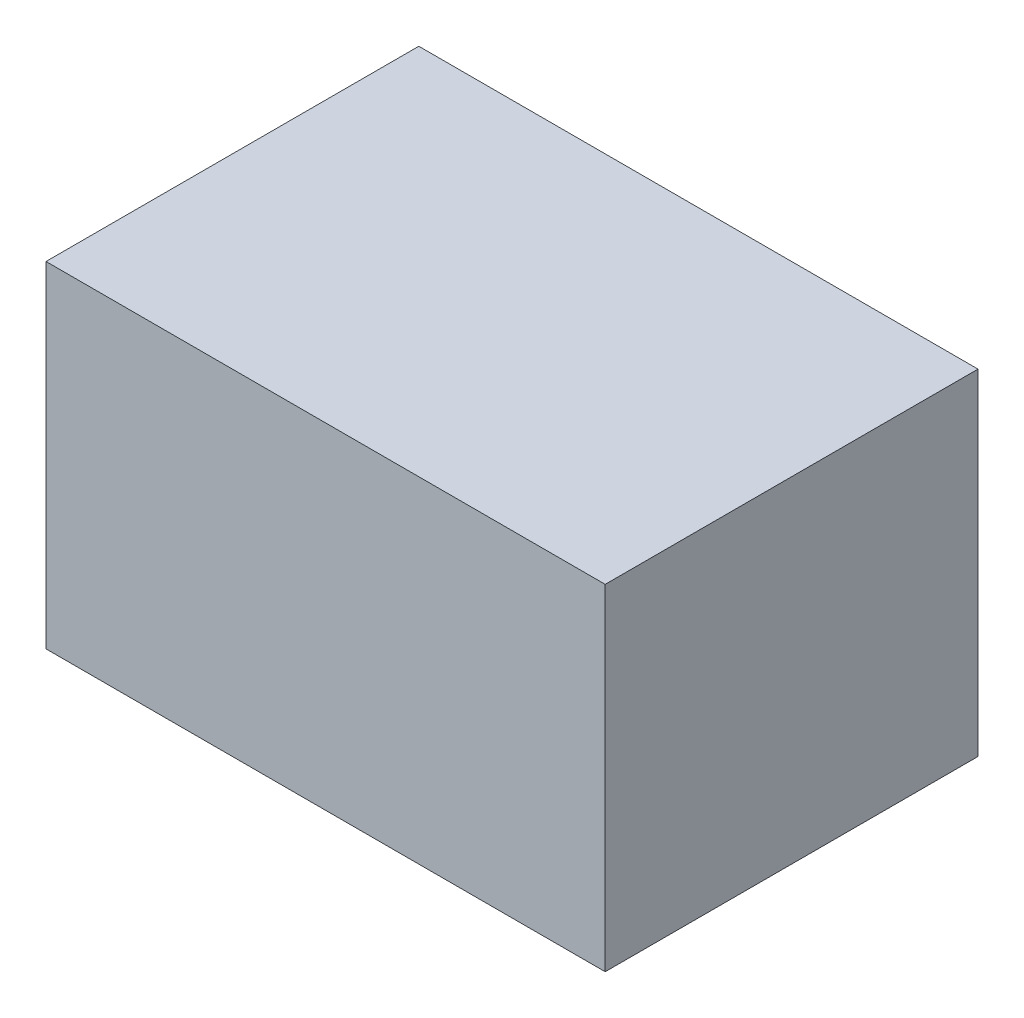
ISO-10303-21;
HEADER;
FILE_DESCRIPTION(('STEP AP214'),'2;1');
FILE_NAME('part.step','',(''),(''),'','','');
FILE_SCHEMA(('AUTOMOTIVE_DESIGN { 1 0 10303 214 1 1 1 1 }'));
ENDSEC;
DATA;
#1=APPLICATION_CONTEXT('core data for automotive mechanical design processes');
#2=APPLICATION_PROTOCOL_DEFINITION('international standard','automotive_design',2000,#1);
#3=PRODUCT_CONTEXT('',#1,'mechanical');
#4=PRODUCT('Part','Part','',(#3));
#5=PRODUCT_RELATED_PRODUCT_CATEGORY('part','',(#4));
#6=PRODUCT_DEFINITION_FORMATION('','',#4);
#7=PRODUCT_DEFINITION_CONTEXT('part definition',#1,'design');
#8=PRODUCT_DEFINITION('design','',#6,#7);
#9=PRODUCT_DEFINITION_SHAPE('','',#8);
#10=(LENGTH_UNIT() NAMED_UNIT(*) SI_UNIT(.MILLI.,.METRE.));
#11=(NAMED_UNIT(*) PLANE_ANGLE_UNIT() SI_UNIT($,.RADIAN.));
#12=(NAMED_UNIT(*) SI_UNIT($,.STERADIAN.) SOLID_ANGLE_UNIT());
#13=UNCERTAINTY_MEASURE_WITH_UNIT(LENGTH_MEASURE(1.E-05),#10,'distance_accuracy_value','');
#14=(GEOMETRIC_REPRESENTATION_CONTEXT(3) GLOBAL_UNCERTAINTY_ASSIGNED_CONTEXT((#13)) GLOBAL_UNIT_ASSIGNED_CONTEXT((#10,
#11,#12)) REPRESENTATION_CONTEXT('',''));
#15=CARTESIAN_POINT('',(0.,0.,0.));
#16=DIRECTION('',(0.,0.,1.));
#17=DIRECTION('',(1.,0.,0.));
#18=AXIS2_PLACEMENT_3D('',#15,#16,#17);
#19=CARTESIAN_POINT('',(15.,18.,10.));
#20=DIRECTION('',(-1.,0.,0.));
#21=DIRECTION('',(0.,0.,1.));
#22=AXIS2_PLACEMENT_3D('',#19,#20,#21);
#23=PLANE('',#22);
#24=DIRECTION('',(0.,0.,-1.));
#25=VECTOR('',#24,1.);
#26=CARTESIAN_POINT('',(15.,0.,10.));
#27=LINE('',#26,#25);
#28=CARTESIAN_POINT('',(15.,0.,10.));
#29=VERTEX_POINT('',#28);
#30=CARTESIAN_POINT('',(15.,0.,-10.));
#31=VERTEX_POINT('',#30);
#32=EDGE_CURVE('E98',#29,#31,#27,.T.);
#33=ORIENTED_EDGE('',*,*,#32,.T.);
#34=DIRECTION('',(0.,-1.,0.));
#35=VECTOR('',#34,1.);
#36=CARTESIAN_POINT('',(15.,18.,-10.));
#37=LINE('',#36,#35);
#38=CARTESIAN_POINT('',(15.,18.,-10.));
#39=VERTEX_POINT('',#38);
#40=EDGE_CURVE('E11',#39,#31,#37,.T.);
#41=ORIENTED_EDGE('',*,*,#40,.F.);
#42=DIRECTION('',(0.,0.,-1.));
#43=VECTOR('',#42,1.);
#44=CARTESIAN_POINT('',(15.,18.,10.));
#45=LINE('',#44,#43);
#46=CARTESIAN_POINT('',(15.,18.,10.));
#47=VERTEX_POINT('',#46);
#48=EDGE_CURVE('E86',#47,#39,#45,.T.);
#49=ORIENTED_EDGE('',*,*,#48,.F.);
#50=DIRECTION('',(0.,-1.,0.));
#51=VECTOR('',#50,1.);
#52=CARTESIAN_POINT('',(15.,18.,10.));
#53=LINE('',#52,#51);
#54=EDGE_CURVE('E94',#47,#29,#53,.T.);
#55=ORIENTED_EDGE('',*,*,#54,.T.);
#56=EDGE_LOOP('',(#33,#41,#49,#55));
#57=FACE_BOUND('',#56,.T.);
#58=ADVANCED_FACE('F35',(#57),#23,.F.);
#59=CARTESIAN_POINT('',(-15.,18.,-10.));
#60=DIRECTION('',(0.,0.,1.));
#61=DIRECTION('',(1.,0.,0.));
#62=AXIS2_PLACEMENT_3D('',#59,#60,#61);
#63=PLANE('',#62);
#64=DIRECTION('',(-1.,0.,0.));
#65=VECTOR('',#64,1.);
#66=CARTESIAN_POINT('',(-15.,0.,-10.));
#67=LINE('',#66,#65);
#68=CARTESIAN_POINT('',(-15.,0.,-10.));
#69=VERTEX_POINT('',#68);
#70=EDGE_CURVE('E90',#31,#69,#67,.T.);
#71=ORIENTED_EDGE('',*,*,#70,.T.);
#72=DIRECTION('',(0.,-1.,0.));
#73=VECTOR('',#72,1.);
#74=CARTESIAN_POINT('',(-15.,18.,-10.));
#75=LINE('',#74,#73);
#76=CARTESIAN_POINT('',(-15.,18.,-10.));
#77=VERTEX_POINT('',#76);
#78=EDGE_CURVE('E43',#77,#69,#75,.T.);
#79=ORIENTED_EDGE('',*,*,#78,.F.);
#80=DIRECTION('',(-1.,0.,0.));
#81=VECTOR('',#80,1.);
#82=CARTESIAN_POINT('',(-15.,18.,-10.));
#83=LINE('',#82,#81);
#84=EDGE_CURVE('E81',#39,#77,#83,.T.);
#85=ORIENTED_EDGE('',*,*,#84,.F.);
#86=ORIENTED_EDGE('',*,*,#40,.T.);
#87=EDGE_LOOP('',(#71,#79,#85,#86));
#88=FACE_BOUND('',#87,.T.);
#89=ADVANCED_FACE('F89',(#88),#63,.F.);
#90=CARTESIAN_POINT('',(-15.,18.,10.));
#91=DIRECTION('',(1.,0.,0.));
#92=DIRECTION('',(0.,0.,-1.));
#93=AXIS2_PLACEMENT_3D('',#90,#91,#92);
#94=PLANE('',#93);
#95=DIRECTION('',(0.,0.,1.));
#96=VECTOR('',#95,1.);
#97=CARTESIAN_POINT('',(-15.,0.,10.));
#98=LINE('',#97,#96);
#99=CARTESIAN_POINT('',(-15.,0.,10.));
#100=VERTEX_POINT('',#99);
#101=EDGE_CURVE('E68',#69,#100,#98,.T.);
#102=ORIENTED_EDGE('',*,*,#101,.T.);
#103=DIRECTION('',(0.,-1.,0.));
#104=VECTOR('',#103,1.);
#105=CARTESIAN_POINT('',(-15.,18.,10.));
#106=LINE('',#105,#104);
#107=CARTESIAN_POINT('',(-15.,18.,10.));
#108=VERTEX_POINT('',#107);
#109=EDGE_CURVE('E91',#108,#100,#106,.T.);
#110=ORIENTED_EDGE('',*,*,#109,.F.);
#111=DIRECTION('',(0.,0.,1.));
#112=VECTOR('',#111,1.);
#113=CARTESIAN_POINT('',(-15.,18.,10.));
#114=LINE('',#113,#112);
#115=EDGE_CURVE('E84',#77,#108,#114,.T.);
#116=ORIENTED_EDGE('',*,*,#115,.F.);
#117=ORIENTED_EDGE('',*,*,#78,.T.);
#118=EDGE_LOOP('',(#102,#110,#116,#117));
#119=FACE_BOUND('',#118,.T.);
#120=ADVANCED_FACE('F92',(#119),#94,.F.);
#121=CARTESIAN_POINT('',(-15.,18.,10.));
#122=DIRECTION('',(0.,0.,-1.));
#123=DIRECTION('',(-1.,0.,0.));
#124=AXIS2_PLACEMENT_3D('',#121,#122,#123);
#125=PLANE('',#124);
#126=DIRECTION('',(1.,0.,0.));
#127=VECTOR('',#126,1.);
#128=CARTESIAN_POINT('',(-15.,0.,10.));
#129=LINE('',#128,#127);
#130=EDGE_CURVE('E74',#100,#29,#129,.T.);
#131=ORIENTED_EDGE('',*,*,#130,.T.);
#132=ORIENTED_EDGE('',*,*,#54,.F.);
#133=DIRECTION('',(1.,0.,0.));
#134=VECTOR('',#133,1.);
#135=CARTESIAN_POINT('',(-15.,18.,10.));
#136=LINE('',#135,#134);
#137=EDGE_CURVE('E51',#108,#47,#136,.T.);
#138=ORIENTED_EDGE('',*,*,#137,.F.);
#139=ORIENTED_EDGE('',*,*,#109,.T.);
#140=EDGE_LOOP('',(#131,#132,#138,#139));
#141=FACE_BOUND('',#140,.T.);
#142=ADVANCED_FACE('F105',(#141),#125,.F.);
#143=CARTESIAN_POINT('',(0.,18.,0.));
#144=DIRECTION('',(0.,-1.,0.));
#145=DIRECTION('',(0.,0.,-1.));
#146=AXIS2_PLACEMENT_3D('',#143,#144,#145);
#147=PLANE('',#146);
#148=ORIENTED_EDGE('',*,*,#48,.T.);
#149=ORIENTED_EDGE('',*,*,#84,.T.);
#150=ORIENTED_EDGE('',*,*,#115,.T.);
#151=ORIENTED_EDGE('',*,*,#137,.T.);
#152=EDGE_LOOP('',(#148,#149,#150,#151));
#153=FACE_BOUND('',#152,.T.);
#154=ADVANCED_FACE('F82',(#153),#147,.F.);
#155=CARTESIAN_POINT('',(0.,0.,0.));
#156=DIRECTION('',(0.,-1.,0.));
#157=DIRECTION('',(0.,0.,-1.));
#158=AXIS2_PLACEMENT_3D('',#155,#156,#157);
#159=PLANE('',#158);
#160=ORIENTED_EDGE('',*,*,#32,.F.);
#161=ORIENTED_EDGE('',*,*,#130,.F.);
#162=ORIENTED_EDGE('',*,*,#101,.F.);
#163=ORIENTED_EDGE('',*,*,#70,.F.);
#164=EDGE_LOOP('',(#160,#161,#162,#163));
#165=FACE_BOUND('',#164,.T.);
#166=ADVANCED_FACE('F108',(#165),#159,.T.);
#167=CLOSED_SHELL('',(#58,#89,#120,#142,#154,#166));
#168=MANIFOLD_SOLID_BREP('B2',#167);
#169=ADVANCED_BREP_SHAPE_REPRESENTATION('',(#18,#168),#14);
#170=SHAPE_DEFINITION_REPRESENTATION(#9,#169);
ENDSEC;
END-ISO-10303-21;
